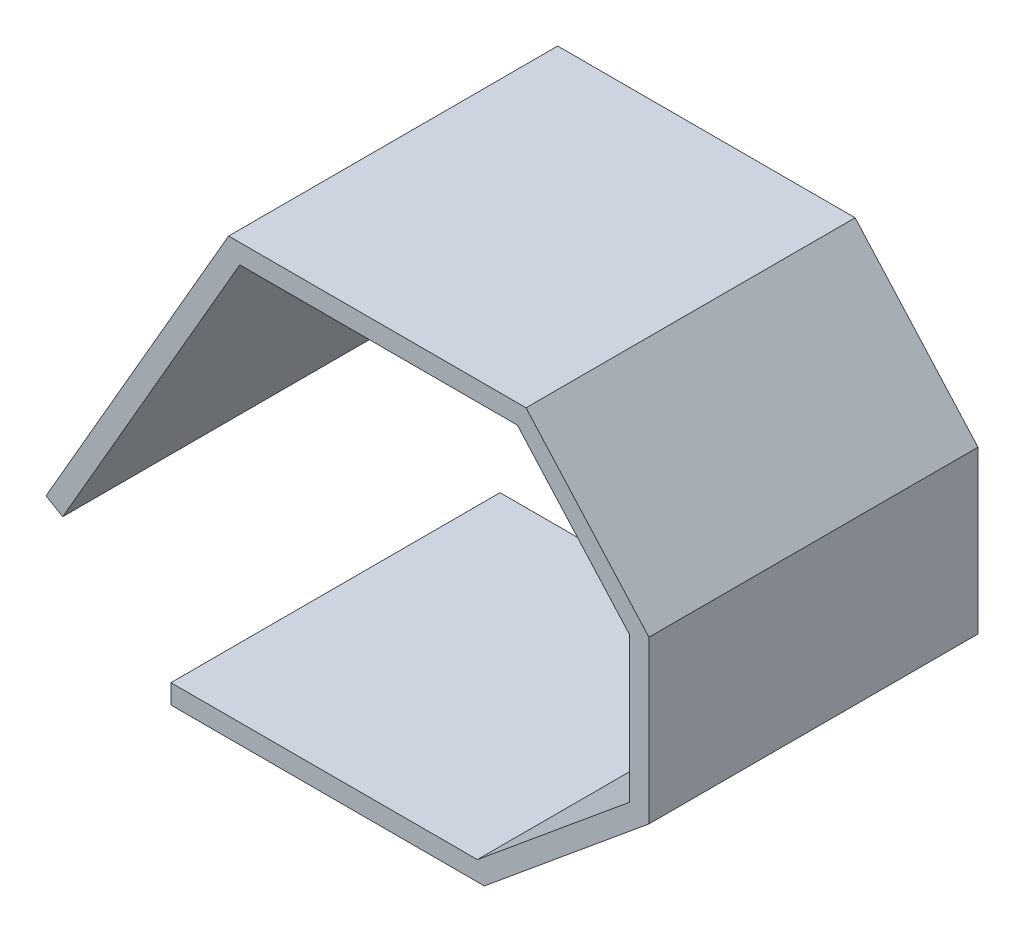
ISO-10303-21;
HEADER;
FILE_DESCRIPTION(('STEP AP214'),'2;1');
FILE_NAME('part.step','',(''),(''),'','','');
FILE_SCHEMA(('AUTOMOTIVE_DESIGN { 1 0 10303 214 1 1 1 1 }'));
ENDSEC;
DATA;
#1=APPLICATION_CONTEXT('core data for automotive mechanical design processes');
#2=APPLICATION_PROTOCOL_DEFINITION('international standard','automotive_design',2000,#1);
#3=PRODUCT_CONTEXT('',#1,'mechanical');
#4=PRODUCT('Part','Part','',(#3));
#5=PRODUCT_RELATED_PRODUCT_CATEGORY('part','',(#4));
#6=PRODUCT_DEFINITION_FORMATION('','',#4);
#7=PRODUCT_DEFINITION_CONTEXT('part definition',#1,'design');
#8=PRODUCT_DEFINITION('design','',#6,#7);
#9=PRODUCT_DEFINITION_SHAPE('','',#8);
#10=(LENGTH_UNIT() NAMED_UNIT(*) SI_UNIT(.MILLI.,.METRE.));
#11=(NAMED_UNIT(*) PLANE_ANGLE_UNIT() SI_UNIT($,.RADIAN.));
#12=(NAMED_UNIT(*) SI_UNIT($,.STERADIAN.) SOLID_ANGLE_UNIT());
#13=UNCERTAINTY_MEASURE_WITH_UNIT(LENGTH_MEASURE(1.E-05),#10,'distance_accuracy_value','');
#14=(GEOMETRIC_REPRESENTATION_CONTEXT(3) GLOBAL_UNCERTAINTY_ASSIGNED_CONTEXT((#13)) GLOBAL_UNIT_ASSIGNED_CONTEXT((#10,
#11,#12)) REPRESENTATION_CONTEXT('',''));
#15=CARTESIAN_POINT('',(0.,0.,0.));
#16=DIRECTION('',(0.,0.,1.));
#17=DIRECTION('',(1.,0.,0.));
#18=AXIS2_PLACEMENT_3D('',#15,#16,#17);
#19=CARTESIAN_POINT('',(-117.050914430896,-44.0759642588437,170.));
#20=DIRECTION('',(1.,0.,0.));
#21=DIRECTION('',(0.,0.,-1.));
#22=AXIS2_PLACEMENT_3D('',#19,#20,#21);
#23=PLANE('',#22);
#24=DIRECTION('',(0.,-1.,0.));
#25=VECTOR('',#24,1.);
#26=CARTESIAN_POINT('',(-117.050914430896,-44.0759642588437,0.));
#27=LINE('',#26,#25);
#28=CARTESIAN_POINT('',(-117.050914430896,-44.0759642588437,0.));
#29=VERTEX_POINT('',#28);
#30=CARTESIAN_POINT('',(-117.050914430896,-54.0759642588437,0.));
#31=VERTEX_POINT('',#30);
#32=EDGE_CURVE('E165',#29,#31,#27,.T.);
#33=ORIENTED_EDGE('',*,*,#32,.T.);
#34=DIRECTION('',(0.,0.,-1.));
#35=VECTOR('',#34,1.);
#36=CARTESIAN_POINT('',(-117.050914430896,-54.0759642588437,170.));
#37=LINE('',#36,#35);
#38=CARTESIAN_POINT('',(-117.050914430896,-54.0759642588437,170.));
#39=VERTEX_POINT('',#38);
#40=EDGE_CURVE('E11',#39,#31,#37,.T.);
#41=ORIENTED_EDGE('',*,*,#40,.F.);
#42=DIRECTION('',(0.,-1.,0.));
#43=VECTOR('',#42,1.);
#44=CARTESIAN_POINT('',(-117.050914430896,-44.0759642588437,170.));
#45=LINE('',#44,#43);
#46=CARTESIAN_POINT('',(-117.050914430896,-44.0759642588437,170.));
#47=VERTEX_POINT('',#46);
#48=EDGE_CURVE('E191',#47,#39,#45,.T.);
#49=ORIENTED_EDGE('',*,*,#48,.F.);
#50=DIRECTION('',(0.,0.,-1.));
#51=VECTOR('',#50,1.);
#52=CARTESIAN_POINT('',(-117.050914430896,-44.0759642588437,170.));
#53=LINE('',#52,#51);
#54=EDGE_CURVE('E161',#47,#29,#53,.T.);
#55=ORIENTED_EDGE('',*,*,#54,.T.);
#56=EDGE_LOOP('',(#33,#41,#49,#55));
#57=FACE_BOUND('',#56,.T.);
#58=ADVANCED_FACE('F33',(#57),#23,.F.);
#59=CARTESIAN_POINT('',(-117.050914430896,-54.0759642588437,170.));
#60=DIRECTION('',(0.,1.,0.));
#61=DIRECTION('',(-1.,0.,0.));
#62=AXIS2_PLACEMENT_3D('',#59,#60,#61);
#63=PLANE('',#62);
#64=DIRECTION('',(1.,0.,0.));
#65=VECTOR('',#64,1.);
#66=CARTESIAN_POINT('',(-117.050914430896,-54.0759642588437,0.));
#67=LINE('',#66,#65);
#68=CARTESIAN_POINT('',(44.837392927817,-54.0759642588436,0.));
#69=VERTEX_POINT('',#68);
#70=EDGE_CURVE('E168',#31,#69,#67,.T.);
#71=ORIENTED_EDGE('',*,*,#70,.T.);
#72=DIRECTION('',(0.,0.,-1.));
#73=VECTOR('',#72,1.);
#74=CARTESIAN_POINT('',(44.837392927817,-54.0759642588436,170.));
#75=LINE('',#74,#73);
#76=CARTESIAN_POINT('',(44.837392927817,-54.0759642588436,170.));
#77=VERTEX_POINT('',#76);
#78=EDGE_CURVE('E41',#77,#69,#75,.T.);
#79=ORIENTED_EDGE('',*,*,#78,.F.);
#80=DIRECTION('',(1.,0.,0.));
#81=VECTOR('',#80,1.);
#82=CARTESIAN_POINT('',(-117.050914430896,-54.0759642588437,170.));
#83=LINE('',#82,#81);
#84=EDGE_CURVE('E110',#39,#77,#83,.T.);
#85=ORIENTED_EDGE('',*,*,#84,.F.);
#86=ORIENTED_EDGE('',*,*,#40,.T.);
#87=EDGE_LOOP('',(#71,#79,#85,#86));
#88=FACE_BOUND('',#87,.T.);
#89=ADVANCED_FACE('F279',(#88),#63,.F.);
#90=CARTESIAN_POINT('',(44.837392927817,-54.0759642588436,170.));
#91=DIRECTION('',(-0.636946763845331,0.770907789574706,0.));
#92=DIRECTION('',(-0.770907789574707,-0.636946763845331,0.));
#93=AXIS2_PLACEMENT_3D('',#90,#91,#92);
#94=PLANE('',#93);
#95=DIRECTION('',(0.770907789574707,0.636946763845331,0.));
#96=VECTOR('',#95,1.);
#97=CARTESIAN_POINT('',(44.837392927817,-54.0759642588436,0.));
#98=LINE('',#97,#96);
#99=CARTESIAN_POINT('',(129.85569228282,16.1686634049624,0.));
#100=VERTEX_POINT('',#99);
#101=EDGE_CURVE('E170',#69,#100,#98,.T.);
#102=ORIENTED_EDGE('',*,*,#101,.T.);
#103=DIRECTION('',(0.,0.,-1.));
#104=VECTOR('',#103,1.);
#105=CARTESIAN_POINT('',(129.85569228282,16.1686634049624,170.));
#106=LINE('',#105,#104);
#107=CARTESIAN_POINT('',(129.85569228282,16.1686634049624,170.));
#108=VERTEX_POINT('',#107);
#109=EDGE_CURVE('E216',#108,#100,#106,.T.);
#110=ORIENTED_EDGE('',*,*,#109,.F.);
#111=DIRECTION('',(0.770907789574707,0.636946763845331,0.));
#112=VECTOR('',#111,1.);
#113=CARTESIAN_POINT('',(44.837392927817,-54.0759642588436,170.));
#114=LINE('',#113,#112);
#115=EDGE_CURVE('E224',#77,#108,#114,.T.);
#116=ORIENTED_EDGE('',*,*,#115,.F.);
#117=ORIENTED_EDGE('',*,*,#78,.T.);
#118=EDGE_LOOP('',(#102,#110,#116,#117));
#119=FACE_BOUND('',#118,.T.);
#120=ADVANCED_FACE('F222',(#119),#94,.F.);
#121=CARTESIAN_POINT('',(129.85569228282,16.1686634049624,170.));
#122=DIRECTION('',(-1.,0.,0.));
#123=DIRECTION('',(0.,0.,1.));
#124=AXIS2_PLACEMENT_3D('',#121,#122,#123);
#125=PLANE('',#124);
#126=DIRECTION('',(0.,1.,0.));
#127=VECTOR('',#126,1.);
#128=CARTESIAN_POINT('',(129.85569228282,16.1686634049624,0.));
#129=LINE('',#128,#127);
#130=CARTESIAN_POINT('',(129.85569228282,99.7057102097541,0.));
#131=VERTEX_POINT('',#130);
#132=EDGE_CURVE('E172',#100,#131,#129,.T.);
#133=ORIENTED_EDGE('',*,*,#132,.T.);
#134=DIRECTION('',(0.,0.,-1.));
#135=VECTOR('',#134,1.);
#136=CARTESIAN_POINT('',(129.85569228282,99.7057102097541,170.));
#137=LINE('',#136,#135);
#138=CARTESIAN_POINT('',(129.85569228282,99.7057102097541,170.));
#139=VERTEX_POINT('',#138);
#140=EDGE_CURVE('E213',#139,#131,#137,.T.);
#141=ORIENTED_EDGE('',*,*,#140,.F.);
#142=DIRECTION('',(0.,1.,0.));
#143=VECTOR('',#142,1.);
#144=CARTESIAN_POINT('',(129.85569228282,16.1686634049624,170.));
#145=LINE('',#144,#143);
#146=EDGE_CURVE('E242',#108,#139,#145,.T.);
#147=ORIENTED_EDGE('',*,*,#146,.F.);
#148=ORIENTED_EDGE('',*,*,#109,.T.);
#149=EDGE_LOOP('',(#133,#141,#147,#148));
#150=FACE_BOUND('',#149,.T.);
#151=ADVANCED_FACE('F233',(#150),#125,.F.);
#152=CARTESIAN_POINT('',(129.85569228282,99.7057102097541,170.));
#153=DIRECTION('',(-0.745181874068178,-0.666861285846043,0.));
#154=DIRECTION('',(0.666861285846043,-0.745181874068178,0.));
#155=AXIS2_PLACEMENT_3D('',#152,#153,#154);
#156=PLANE('',#155);
#157=DIRECTION('',(-0.666861285846043,0.745181874068178,0.));
#158=VECTOR('',#157,1.);
#159=CARTESIAN_POINT('',(129.85569228282,99.7057102097541,0.));
#160=LINE('',#159,#158);
#161=CARTESIAN_POINT('',(66.3886519023622,170.626738459682,0.));
#162=VERTEX_POINT('',#161);
#163=EDGE_CURVE('E174',#131,#162,#160,.T.);
#164=ORIENTED_EDGE('',*,*,#163,.T.);
#165=DIRECTION('',(0.,0.,-1.));
#166=VECTOR('',#165,1.);
#167=CARTESIAN_POINT('',(66.3886519023622,170.626738459682,170.));
#168=LINE('',#167,#166);
#169=CARTESIAN_POINT('',(66.3886519023622,170.626738459682,170.));
#170=VERTEX_POINT('',#169);
#171=EDGE_CURVE('E210',#170,#162,#168,.T.);
#172=ORIENTED_EDGE('',*,*,#171,.F.);
#173=DIRECTION('',(-0.666861285846043,0.745181874068178,0.));
#174=VECTOR('',#173,1.);
#175=CARTESIAN_POINT('',(129.85569228282,99.7057102097541,170.));
#176=LINE('',#175,#174);
#177=EDGE_CURVE('E239',#139,#170,#176,.T.);
#178=ORIENTED_EDGE('',*,*,#177,.F.);
#179=ORIENTED_EDGE('',*,*,#140,.T.);
#180=EDGE_LOOP('',(#164,#172,#178,#179));
#181=FACE_BOUND('',#180,.T.);
#182=ADVANCED_FACE('F237',(#181),#156,.F.);
#183=CARTESIAN_POINT('',(66.3886519023622,170.626738459682,170.));
#184=DIRECTION('',(0.,-1.,0.));
#185=DIRECTION('',(1.,0.,0.));
#186=AXIS2_PLACEMENT_3D('',#183,#184,#185);
#187=PLANE('',#186);
#188=DIRECTION('',(-1.,0.,0.));
#189=VECTOR('',#188,1.);
#190=CARTESIAN_POINT('',(66.3886519023622,170.626738459682,0.));
#191=LINE('',#190,#189);
#192=CARTESIAN_POINT('',(-87.2594677296721,170.626738459682,0.));
#193=VERTEX_POINT('',#192);
#194=EDGE_CURVE('E176',#162,#193,#191,.T.);
#195=ORIENTED_EDGE('',*,*,#194,.T.);
#196=DIRECTION('',(0.,0.,-1.));
#197=VECTOR('',#196,1.);
#198=CARTESIAN_POINT('',(-87.2594677296721,170.626738459682,170.));
#199=LINE('',#198,#197);
#200=CARTESIAN_POINT('',(-87.2594677296721,170.626738459682,170.));
#201=VERTEX_POINT('',#200);
#202=EDGE_CURVE('E207',#201,#193,#199,.T.);
#203=ORIENTED_EDGE('',*,*,#202,.F.);
#204=DIRECTION('',(-1.,0.,0.));
#205=VECTOR('',#204,1.);
#206=CARTESIAN_POINT('',(66.3886519023622,170.626738459682,170.));
#207=LINE('',#206,#205);
#208=EDGE_CURVE('E241',#170,#201,#207,.T.);
#209=ORIENTED_EDGE('',*,*,#208,.F.);
#210=ORIENTED_EDGE('',*,*,#171,.T.);
#211=EDGE_LOOP('',(#195,#203,#209,#210));
#212=FACE_BOUND('',#211,.T.);
#213=ADVANCED_FACE('F292',(#212),#187,.F.);
#214=CARTESIAN_POINT('',(-87.2594677296721,170.626738459682,170.));
#215=DIRECTION('',(0.866025403784442,-0.499999999999995,0.));
#216=DIRECTION('',(0.499999999999995,0.866025403784442,0.));
#217=AXIS2_PLACEMENT_3D('',#214,#215,#216);
#218=PLANE('',#217);
#219=DIRECTION('',(-0.499999999999995,-0.866025403784442,0.));
#220=VECTOR('',#219,1.);
#221=CARTESIAN_POINT('',(-87.2594677296721,170.626738459682,0.));
#222=LINE('',#221,#220);
#223=CARTESIAN_POINT('',(-181.587711304629,7.24542799912276,0.));
#224=VERTEX_POINT('',#223);
#225=EDGE_CURVE('E178',#193,#224,#222,.T.);
#226=ORIENTED_EDGE('',*,*,#225,.T.);
#227=DIRECTION('',(0.,0.,-1.));
#228=VECTOR('',#227,1.);
#229=CARTESIAN_POINT('',(-181.587711304629,7.24542799912276,170.));
#230=LINE('',#229,#228);
#231=CARTESIAN_POINT('',(-181.587711304629,7.24542799912276,170.));
#232=VERTEX_POINT('',#231);
#233=EDGE_CURVE('E204',#232,#224,#230,.T.);
#234=ORIENTED_EDGE('',*,*,#233,.F.);
#235=DIRECTION('',(-0.499999999999995,-0.866025403784442,0.));
#236=VECTOR('',#235,1.);
#237=CARTESIAN_POINT('',(-87.2594677296721,170.626738459682,170.));
#238=LINE('',#237,#236);
#239=EDGE_CURVE('E244',#201,#232,#238,.T.);
#240=ORIENTED_EDGE('',*,*,#239,.F.);
#241=ORIENTED_EDGE('',*,*,#202,.T.);
#242=EDGE_LOOP('',(#226,#234,#240,#241));
#243=FACE_BOUND('',#242,.T.);
#244=ADVANCED_FACE('F295',(#243),#218,.F.);
#245=CARTESIAN_POINT('',(-172.927457266784,2.24542799912277,170.));
#246=DIRECTION('',(0.499999999999997,0.86602540378444,0.));
#247=DIRECTION('',(-0.86602540378444,0.499999999999997,0.));
#248=AXIS2_PLACEMENT_3D('',#245,#246,#247);
#249=PLANE('',#248);
#250=DIRECTION('',(0.86602540378444,-0.499999999999997,0.));
#251=VECTOR('',#250,1.);
#252=CARTESIAN_POINT('',(-172.927457266784,2.24542799912277,0.));
#253=LINE('',#252,#251);
#254=CARTESIAN_POINT('',(-172.927457266784,2.24542799912277,0.));
#255=VERTEX_POINT('',#254);
#256=EDGE_CURVE('E180',#224,#255,#253,.T.);
#257=ORIENTED_EDGE('',*,*,#256,.T.);
#258=DIRECTION('',(0.,0.,-1.));
#259=VECTOR('',#258,1.);
#260=CARTESIAN_POINT('',(-172.927457266784,2.24542799912277,170.));
#261=LINE('',#260,#259);
#262=CARTESIAN_POINT('',(-172.927457266784,2.24542799912277,170.));
#263=VERTEX_POINT('',#262);
#264=EDGE_CURVE('E201',#263,#255,#261,.T.);
#265=ORIENTED_EDGE('',*,*,#264,.F.);
#266=DIRECTION('',(0.86602540378444,-0.499999999999997,0.));
#267=VECTOR('',#266,1.);
#268=CARTESIAN_POINT('',(-172.927457266784,2.24542799912277,170.));
#269=LINE('',#268,#267);
#270=EDGE_CURVE('E250',#232,#263,#269,.T.);
#271=ORIENTED_EDGE('',*,*,#270,.F.);
#272=ORIENTED_EDGE('',*,*,#233,.T.);
#273=EDGE_LOOP('',(#257,#265,#271,#272));
#274=FACE_BOUND('',#273,.T.);
#275=ADVANCED_FACE('F299',(#274),#249,.F.);
#276=CARTESIAN_POINT('',(-81.4859650377759,160.626738459682,170.));
#277=DIRECTION('',(-0.866025403784442,0.499999999999995,0.));
#278=DIRECTION('',(-0.499999999999995,-0.866025403784442,0.));
#279=AXIS2_PLACEMENT_3D('',#276,#277,#278);
#280=PLANE('',#279);
#281=DIRECTION('',(0.499999999999995,0.866025403784442,0.));
#282=VECTOR('',#281,1.);
#283=CARTESIAN_POINT('',(-81.4859650377759,160.626738459682,0.));
#284=LINE('',#283,#282);
#285=CARTESIAN_POINT('',(-81.4859650377759,160.626738459682,0.));
#286=VERTEX_POINT('',#285);
#287=EDGE_CURVE('E182',#255,#286,#284,.T.);
#288=ORIENTED_EDGE('',*,*,#287,.T.);
#289=DIRECTION('',(0.,0.,-1.));
#290=VECTOR('',#289,1.);
#291=CARTESIAN_POINT('',(-81.4859650377759,160.626738459682,170.));
#292=LINE('',#291,#290);
#293=CARTESIAN_POINT('',(-81.4859650377759,160.626738459682,170.));
#294=VERTEX_POINT('',#293);
#295=EDGE_CURVE('E198',#294,#286,#292,.T.);
#296=ORIENTED_EDGE('',*,*,#295,.F.);
#297=DIRECTION('',(0.499999999999995,0.866025403784442,0.));
#298=VECTOR('',#297,1.);
#299=CARTESIAN_POINT('',(-81.4859650377759,160.626738459682,170.));
#300=LINE('',#299,#298);
#301=EDGE_CURVE('E252',#263,#294,#300,.T.);
#302=ORIENTED_EDGE('',*,*,#301,.F.);
#303=ORIENTED_EDGE('',*,*,#264,.T.);
#304=EDGE_LOOP('',(#288,#296,#302,#303));
#305=FACE_BOUND('',#304,.T.);
#306=ADVANCED_FACE('F303',(#305),#280,.F.);
#307=CARTESIAN_POINT('',(61.9180826930596,160.626738459682,170.));
#308=DIRECTION('',(0.,1.,0.));
#309=DIRECTION('',(-1.,0.,0.));
#310=AXIS2_PLACEMENT_3D('',#307,#308,#309);
#311=PLANE('',#310);
#312=DIRECTION('',(1.,0.,0.));
#313=VECTOR('',#312,1.);
#314=CARTESIAN_POINT('',(61.9180826930596,160.626738459682,0.));
#315=LINE('',#314,#313);
#316=CARTESIAN_POINT('',(61.9180826930596,160.626738459682,0.));
#317=VERTEX_POINT('',#316);
#318=EDGE_CURVE('E184',#286,#317,#315,.T.);
#319=ORIENTED_EDGE('',*,*,#318,.T.);
#320=DIRECTION('',(0.,0.,-1.));
#321=VECTOR('',#320,1.);
#322=CARTESIAN_POINT('',(61.9180826930596,160.626738459682,170.));
#323=LINE('',#322,#321);
#324=CARTESIAN_POINT('',(61.9180826930596,160.626738459682,170.));
#325=VERTEX_POINT('',#324);
#326=EDGE_CURVE('E195',#325,#317,#323,.T.);
#327=ORIENTED_EDGE('',*,*,#326,.F.);
#328=DIRECTION('',(1.,0.,0.));
#329=VECTOR('',#328,1.);
#330=CARTESIAN_POINT('',(61.9180826930596,160.626738459682,170.));
#331=LINE('',#330,#329);
#332=EDGE_CURVE('E254',#294,#325,#331,.T.);
#333=ORIENTED_EDGE('',*,*,#332,.F.);
#334=ORIENTED_EDGE('',*,*,#295,.T.);
#335=EDGE_LOOP('',(#319,#327,#333,#334));
#336=FACE_BOUND('',#335,.T.);
#337=ADVANCED_FACE('F260',(#336),#311,.F.);
#338=CARTESIAN_POINT('',(119.85569228282,95.8845538262562,170.));
#339=DIRECTION('',(0.745181874068178,0.666861285846043,0.));
#340=DIRECTION('',(-0.666861285846043,0.745181874068178,0.));
#341=AXIS2_PLACEMENT_3D('',#338,#339,#340);
#342=PLANE('',#341);
#343=DIRECTION('',(0.666861285846043,-0.745181874068178,0.));
#344=VECTOR('',#343,1.);
#345=CARTESIAN_POINT('',(119.85569228282,95.8845538262562,0.));
#346=LINE('',#345,#344);
#347=CARTESIAN_POINT('',(119.85569228282,95.8845538262562,0.));
#348=VERTEX_POINT('',#347);
#349=EDGE_CURVE('E186',#317,#348,#346,.T.);
#350=ORIENTED_EDGE('',*,*,#349,.T.);
#351=DIRECTION('',(0.,0.,-1.));
#352=VECTOR('',#351,1.);
#353=CARTESIAN_POINT('',(119.85569228282,95.8845538262562,170.));
#354=LINE('',#353,#352);
#355=CARTESIAN_POINT('',(119.85569228282,95.8845538262562,170.));
#356=VERTEX_POINT('',#355);
#357=EDGE_CURVE('E156',#356,#348,#354,.T.);
#358=ORIENTED_EDGE('',*,*,#357,.F.);
#359=DIRECTION('',(0.666861285846043,-0.745181874068178,0.));
#360=VECTOR('',#359,1.);
#361=CARTESIAN_POINT('',(119.85569228282,95.8845538262562,170.));
#362=LINE('',#361,#360);
#363=EDGE_CURVE('E147',#325,#356,#362,.T.);
#364=ORIENTED_EDGE('',*,*,#363,.F.);
#365=ORIENTED_EDGE('',*,*,#326,.T.);
#366=EDGE_LOOP('',(#350,#358,#364,#365));
#367=FACE_BOUND('',#366,.T.);
#368=ADVANCED_FACE('F264',(#367),#342,.F.);
#369=CARTESIAN_POINT('',(119.85569228282,20.8780883331364,170.));
#370=DIRECTION('',(1.,0.,0.));
#371=DIRECTION('',(0.,0.,-1.));
#372=AXIS2_PLACEMENT_3D('',#369,#370,#371);
#373=PLANE('',#372);
#374=DIRECTION('',(0.,-1.,0.));
#375=VECTOR('',#374,1.);
#376=CARTESIAN_POINT('',(119.85569228282,20.8780883331364,0.));
#377=LINE('',#376,#375);
#378=CARTESIAN_POINT('',(119.85569228282,20.8780883331364,0.));
#379=VERTEX_POINT('',#378);
#380=EDGE_CURVE('E155',#348,#379,#377,.T.);
#381=ORIENTED_EDGE('',*,*,#380,.T.);
#382=DIRECTION('',(0.,0.,-1.));
#383=VECTOR('',#382,1.);
#384=CARTESIAN_POINT('',(119.85569228282,20.8780883331364,170.));
#385=LINE('',#384,#383);
#386=CARTESIAN_POINT('',(119.85569228282,20.8780883331364,170.));
#387=VERTEX_POINT('',#386);
#388=EDGE_CURVE('E152',#387,#379,#385,.T.);
#389=ORIENTED_EDGE('',*,*,#388,.F.);
#390=DIRECTION('',(0.,-1.,0.));
#391=VECTOR('',#390,1.);
#392=CARTESIAN_POINT('',(119.85569228282,20.8780883331364,170.));
#393=LINE('',#392,#391);
#394=EDGE_CURVE('E141',#356,#387,#393,.T.);
#395=ORIENTED_EDGE('',*,*,#394,.F.);
#396=ORIENTED_EDGE('',*,*,#357,.T.);
#397=EDGE_LOOP('',(#381,#389,#395,#396));
#398=FACE_BOUND('',#397,.T.);
#399=ADVANCED_FACE('F153',(#398),#373,.F.);
#400=CARTESIAN_POINT('',(41.2406683123682,-44.0759642588436,170.));
#401=DIRECTION('',(0.636946763845331,-0.770907789574707,0.));
#402=DIRECTION('',(0.770907789574707,0.636946763845331,0.));
#403=AXIS2_PLACEMENT_3D('',#400,#401,#402);
#404=PLANE('',#403);
#405=DIRECTION('',(-0.770907789574706,-0.636946763845331,0.));
#406=VECTOR('',#405,1.);
#407=CARTESIAN_POINT('',(41.2406683123682,-44.0759642588436,0.));
#408=LINE('',#407,#406);
#409=CARTESIAN_POINT('',(41.2406683123682,-44.0759642588436,0.));
#410=VERTEX_POINT('',#409);
#411=EDGE_CURVE('E96',#379,#410,#408,.T.);
#412=ORIENTED_EDGE('',*,*,#411,.T.);
#413=DIRECTION('',(0.,0.,-1.));
#414=VECTOR('',#413,1.);
#415=CARTESIAN_POINT('',(41.2406683123682,-44.0759642588436,170.));
#416=LINE('',#415,#414);
#417=CARTESIAN_POINT('',(41.2406683123682,-44.0759642588436,170.));
#418=VERTEX_POINT('',#417);
#419=EDGE_CURVE('E157',#418,#410,#416,.T.);
#420=ORIENTED_EDGE('',*,*,#419,.F.);
#421=DIRECTION('',(-0.770907789574706,-0.636946763845331,0.));
#422=VECTOR('',#421,1.);
#423=CARTESIAN_POINT('',(41.2406683123682,-44.0759642588436,170.));
#424=LINE('',#423,#422);
#425=EDGE_CURVE('E145',#387,#418,#424,.T.);
#426=ORIENTED_EDGE('',*,*,#425,.F.);
#427=ORIENTED_EDGE('',*,*,#388,.T.);
#428=EDGE_LOOP('',(#412,#420,#426,#427));
#429=FACE_BOUND('',#428,.T.);
#430=ADVANCED_FACE('F159',(#429),#404,.F.);
#431=CARTESIAN_POINT('',(-117.050914430896,-44.0759642588437,170.));
#432=DIRECTION('',(0.,-1.,0.));
#433=DIRECTION('',(1.,0.,0.));
#434=AXIS2_PLACEMENT_3D('',#431,#432,#433);
#435=PLANE('',#434);
#436=DIRECTION('',(-1.,0.,0.));
#437=VECTOR('',#436,1.);
#438=CARTESIAN_POINT('',(-117.050914430896,-44.0759642588437,0.));
#439=LINE('',#438,#437);
#440=EDGE_CURVE('E102',#410,#29,#439,.T.);
#441=ORIENTED_EDGE('',*,*,#440,.T.);
#442=ORIENTED_EDGE('',*,*,#54,.F.);
#443=DIRECTION('',(-1.,0.,0.));
#444=VECTOR('',#443,1.);
#445=CARTESIAN_POINT('',(-117.050914430896,-44.0759642588437,170.));
#446=LINE('',#445,#444);
#447=EDGE_CURVE('E49',#418,#47,#446,.T.);
#448=ORIENTED_EDGE('',*,*,#447,.F.);
#449=ORIENTED_EDGE('',*,*,#419,.T.);
#450=EDGE_LOOP('',(#441,#442,#448,#449));
#451=FACE_BOUND('',#450,.T.);
#452=ADVANCED_FACE('F268',(#451),#435,.F.);
#453=CARTESIAN_POINT('',(0.,0.,170.));
#454=DIRECTION('',(0.,0.,1.));
#455=DIRECTION('',(1.,0.,0.));
#456=AXIS2_PLACEMENT_3D('',#453,#454,#455);
#457=PLANE('',#456);
#458=ORIENTED_EDGE('',*,*,#48,.T.);
#459=ORIENTED_EDGE('',*,*,#84,.T.);
#460=ORIENTED_EDGE('',*,*,#115,.T.);
#461=ORIENTED_EDGE('',*,*,#146,.T.);
#462=ORIENTED_EDGE('',*,*,#177,.T.);
#463=ORIENTED_EDGE('',*,*,#208,.T.);
#464=ORIENTED_EDGE('',*,*,#239,.T.);
#465=ORIENTED_EDGE('',*,*,#270,.T.);
#466=ORIENTED_EDGE('',*,*,#301,.T.);
#467=ORIENTED_EDGE('',*,*,#332,.T.);
#468=ORIENTED_EDGE('',*,*,#363,.T.);
#469=ORIENTED_EDGE('',*,*,#394,.T.);
#470=ORIENTED_EDGE('',*,*,#425,.T.);
#471=ORIENTED_EDGE('',*,*,#447,.T.);
#472=EDGE_LOOP('',(#458,#459,#460,#461,#462,#463,#464,#465,#466,#467,#468,#469,#470,#471));
#473=FACE_BOUND('',#472,.T.);
#474=ADVANCED_FACE('F143',(#473),#457,.T.);
#475=CARTESIAN_POINT('',(0.,0.,0.));
#476=DIRECTION('',(0.,0.,1.));
#477=DIRECTION('',(1.,0.,0.));
#478=AXIS2_PLACEMENT_3D('',#475,#476,#477);
#479=PLANE('',#478);
#480=ORIENTED_EDGE('',*,*,#32,.F.);
#481=ORIENTED_EDGE('',*,*,#440,.F.);
#482=ORIENTED_EDGE('',*,*,#411,.F.);
#483=ORIENTED_EDGE('',*,*,#380,.F.);
#484=ORIENTED_EDGE('',*,*,#349,.F.);
#485=ORIENTED_EDGE('',*,*,#318,.F.);
#486=ORIENTED_EDGE('',*,*,#287,.F.);
#487=ORIENTED_EDGE('',*,*,#256,.F.);
#488=ORIENTED_EDGE('',*,*,#225,.F.);
#489=ORIENTED_EDGE('',*,*,#194,.F.);
#490=ORIENTED_EDGE('',*,*,#163,.F.);
#491=ORIENTED_EDGE('',*,*,#132,.F.);
#492=ORIENTED_EDGE('',*,*,#101,.F.);
#493=ORIENTED_EDGE('',*,*,#70,.F.);
#494=EDGE_LOOP('',(#480,#481,#482,#483,#484,#485,#486,#487,#488,#489,#490,#491,#492,#493));
#495=FACE_BOUND('',#494,.T.);
#496=ADVANCED_FACE('F228',(#495),#479,.F.);
#497=CLOSED_SHELL('',(#58,#89,#120,#151,#182,#213,#244,#275,#306,#337,#368,#399,#430,#452,#474,#496));
#498=MANIFOLD_SOLID_BREP('B2',#497);
#499=ADVANCED_BREP_SHAPE_REPRESENTATION('',(#18,#498),#14);
#500=SHAPE_DEFINITION_REPRESENTATION(#9,#499);
ENDSEC;
END-ISO-10303-21;
